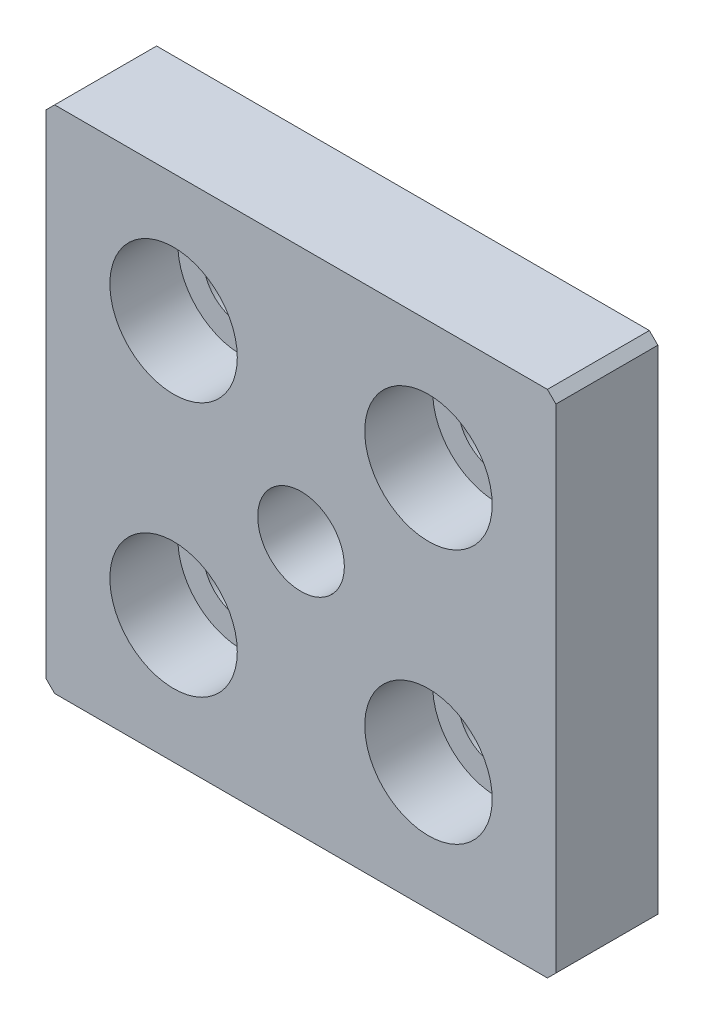
ISO-10303-21;
HEADER;
FILE_DESCRIPTION(('STEP AP214'),'2;1');
FILE_NAME('part.step','',(''),(''),'','','');
FILE_SCHEMA(('AUTOMOTIVE_DESIGN { 1 0 10303 214 1 1 1 1 }'));
ENDSEC;
DATA;
#1=APPLICATION_CONTEXT('core data for automotive mechanical design processes');
#2=APPLICATION_PROTOCOL_DEFINITION('international standard','automotive_design',2000,#1);
#3=PRODUCT_CONTEXT('',#1,'mechanical');
#4=PRODUCT('Part','Part','',(#3));
#5=PRODUCT_RELATED_PRODUCT_CATEGORY('part','',(#4));
#6=PRODUCT_DEFINITION_FORMATION('','',#4);
#7=PRODUCT_DEFINITION_CONTEXT('part definition',#1,'design');
#8=PRODUCT_DEFINITION('design','',#6,#7);
#9=PRODUCT_DEFINITION_SHAPE('','',#8);
#10=(LENGTH_UNIT() NAMED_UNIT(*) SI_UNIT(.MILLI.,.METRE.));
#11=(NAMED_UNIT(*) PLANE_ANGLE_UNIT() SI_UNIT($,.RADIAN.));
#12=(NAMED_UNIT(*) SI_UNIT($,.STERADIAN.) SOLID_ANGLE_UNIT());
#13=UNCERTAINTY_MEASURE_WITH_UNIT(LENGTH_MEASURE(1.E-05),#10,'distance_accuracy_value','');
#14=(GEOMETRIC_REPRESENTATION_CONTEXT(3) GLOBAL_UNCERTAINTY_ASSIGNED_CONTEXT((#13)) GLOBAL_UNIT_ASSIGNED_CONTEXT((#10,
#11,#12)) REPRESENTATION_CONTEXT('',''));
#15=CARTESIAN_POINT('',(0.,0.,0.));
#16=DIRECTION('',(0.,0.,1.));
#17=DIRECTION('',(1.,0.,0.));
#18=AXIS2_PLACEMENT_3D('',#15,#16,#17);
#19=CARTESIAN_POINT('',(30.,30.,12.));
#20=DIRECTION('',(-1.,0.,0.));
#21=DIRECTION('',(0.,-1.,0.));
#22=AXIS2_PLACEMENT_3D('',#19,#20,#21);
#23=PLANE('',#22);
#24=DIRECTION('',(0.,1.,0.));
#25=VECTOR('',#24,1.);
#26=CARTESIAN_POINT('',(30.,30.,12.));
#27=LINE('',#26,#25);
#28=CARTESIAN_POINT('',(30.,-29.,12.));
#29=VERTEX_POINT('',#28);
#30=CARTESIAN_POINT('',(30.,29.,12.));
#31=VERTEX_POINT('',#30);
#32=EDGE_CURVE('E141',#29,#31,#27,.T.);
#33=ORIENTED_EDGE('',*,*,#32,.F.);
#34=DIRECTION('',(0.,0.,-1.));
#35=VECTOR('',#34,1.);
#36=CARTESIAN_POINT('',(30.,-29.,12.));
#37=LINE('',#36,#35);
#38=CARTESIAN_POINT('',(30.,-29.,0.));
#39=VERTEX_POINT('',#38);
#40=EDGE_CURVE('E125',#29,#39,#37,.T.);
#41=ORIENTED_EDGE('',*,*,#40,.T.);
#42=DIRECTION('',(0.,1.,0.));
#43=VECTOR('',#42,1.);
#44=CARTESIAN_POINT('',(30.,30.,0.));
#45=LINE('',#44,#43);
#46=CARTESIAN_POINT('',(30.,29.,0.));
#47=VERTEX_POINT('',#46);
#48=EDGE_CURVE('E138',#39,#47,#45,.T.);
#49=ORIENTED_EDGE('',*,*,#48,.T.);
#50=DIRECTION('',(0.,0.,1.));
#51=VECTOR('',#50,1.);
#52=CARTESIAN_POINT('',(30.,29.,12.));
#53=LINE('',#52,#51);
#54=EDGE_CURVE('E144',#47,#31,#53,.T.);
#55=ORIENTED_EDGE('',*,*,#54,.T.);
#56=EDGE_LOOP('',(#33,#41,#49,#55));
#57=FACE_BOUND('',#56,.T.);
#58=ADVANCED_FACE('F53',(#57),#23,.F.);
#59=CARTESIAN_POINT('',(-30.,30.,12.));
#60=DIRECTION('',(0.,-1.,0.));
#61=DIRECTION('',(0.,0.,-1.));
#62=AXIS2_PLACEMENT_3D('',#59,#60,#61);
#63=PLANE('',#62);
#64=DIRECTION('',(-1.,0.,0.));
#65=VECTOR('',#64,1.);
#66=CARTESIAN_POINT('',(-30.,30.,0.));
#67=LINE('',#66,#65);
#68=CARTESIAN_POINT('',(29.,30.,0.));
#69=VERTEX_POINT('',#68);
#70=CARTESIAN_POINT('',(-29.,30.,0.));
#71=VERTEX_POINT('',#70);
#72=EDGE_CURVE('E149',#69,#71,#67,.T.);
#73=ORIENTED_EDGE('',*,*,#72,.T.);
#74=DIRECTION('',(0.,0.,1.));
#75=VECTOR('',#74,1.);
#76=CARTESIAN_POINT('',(-29.,30.,12.));
#77=LINE('',#76,#75);
#78=CARTESIAN_POINT('',(-29.,30.,12.));
#79=VERTEX_POINT('',#78);
#80=EDGE_CURVE('E11',#71,#79,#77,.T.);
#81=ORIENTED_EDGE('',*,*,#80,.T.);
#82=DIRECTION('',(-1.,0.,0.));
#83=VECTOR('',#82,1.);
#84=CARTESIAN_POINT('',(-30.,30.,12.));
#85=LINE('',#84,#83);
#86=CARTESIAN_POINT('',(29.,30.,12.));
#87=VERTEX_POINT('',#86);
#88=EDGE_CURVE('E206',#87,#79,#85,.T.);
#89=ORIENTED_EDGE('',*,*,#88,.F.);
#90=DIRECTION('',(0.,0.,-1.));
#91=VECTOR('',#90,1.);
#92=CARTESIAN_POINT('',(29.,30.,12.));
#93=LINE('',#92,#91);
#94=EDGE_CURVE('E63',#87,#69,#93,.T.);
#95=ORIENTED_EDGE('',*,*,#94,.T.);
#96=EDGE_LOOP('',(#73,#81,#89,#95));
#97=FACE_BOUND('',#96,.T.);
#98=ADVANCED_FACE('F204',(#97),#63,.F.);
#99=CARTESIAN_POINT('',(-30.,30.,12.));
#100=DIRECTION('',(1.,0.,0.));
#101=DIRECTION('',(0.,1.,0.));
#102=AXIS2_PLACEMENT_3D('',#99,#100,#101);
#103=PLANE('',#102);
#104=DIRECTION('',(0.,-1.,0.));
#105=VECTOR('',#104,1.);
#106=CARTESIAN_POINT('',(-30.,30.,0.));
#107=LINE('',#106,#105);
#108=CARTESIAN_POINT('',(-30.,29.,0.));
#109=VERTEX_POINT('',#108);
#110=CARTESIAN_POINT('',(-30.,-29.,0.));
#111=VERTEX_POINT('',#110);
#112=EDGE_CURVE('E155',#109,#111,#107,.T.);
#113=ORIENTED_EDGE('',*,*,#112,.T.);
#114=DIRECTION('',(0.,0.,1.));
#115=VECTOR('',#114,1.);
#116=CARTESIAN_POINT('',(-30.,-29.,12.));
#117=LINE('',#116,#115);
#118=CARTESIAN_POINT('',(-30.,-29.,12.));
#119=VERTEX_POINT('',#118);
#120=EDGE_CURVE('E70',#111,#119,#117,.T.);
#121=ORIENTED_EDGE('',*,*,#120,.T.);
#122=DIRECTION('',(0.,-1.,0.));
#123=VECTOR('',#122,1.);
#124=CARTESIAN_POINT('',(-30.,30.,12.));
#125=LINE('',#124,#123);
#126=CARTESIAN_POINT('',(-30.,29.,12.));
#127=VERTEX_POINT('',#126);
#128=EDGE_CURVE('E214',#127,#119,#125,.T.);
#129=ORIENTED_EDGE('',*,*,#128,.F.);
#130=DIRECTION('',(0.,0.,-1.));
#131=VECTOR('',#130,1.);
#132=CARTESIAN_POINT('',(-30.,29.,12.));
#133=LINE('',#132,#131);
#134=EDGE_CURVE('E194',#127,#109,#133,.T.);
#135=ORIENTED_EDGE('',*,*,#134,.T.);
#136=EDGE_LOOP('',(#113,#121,#129,#135));
#137=FACE_BOUND('',#136,.T.);
#138=ADVANCED_FACE('F213',(#137),#103,.F.);
#139=CARTESIAN_POINT('',(-30.,-30.,12.));
#140=DIRECTION('',(0.,1.,0.));
#141=DIRECTION('',(0.,0.,1.));
#142=AXIS2_PLACEMENT_3D('',#139,#140,#141);
#143=PLANE('',#142);
#144=DIRECTION('',(1.,0.,0.));
#145=VECTOR('',#144,1.);
#146=CARTESIAN_POINT('',(-30.,-30.,0.));
#147=LINE('',#146,#145);
#148=CARTESIAN_POINT('',(-29.,-30.,0.));
#149=VERTEX_POINT('',#148);
#150=CARTESIAN_POINT('',(29.,-30.,0.));
#151=VERTEX_POINT('',#150);
#152=EDGE_CURVE('E166',#149,#151,#147,.T.);
#153=ORIENTED_EDGE('',*,*,#152,.T.);
#154=DIRECTION('',(0.,0.,1.));
#155=VECTOR('',#154,1.);
#156=CARTESIAN_POINT('',(29.,-30.,12.));
#157=LINE('',#156,#155);
#158=CARTESIAN_POINT('',(29.,-30.,12.));
#159=VERTEX_POINT('',#158);
#160=EDGE_CURVE('E126',#151,#159,#157,.T.);
#161=ORIENTED_EDGE('',*,*,#160,.T.);
#162=DIRECTION('',(1.,0.,0.));
#163=VECTOR('',#162,1.);
#164=CARTESIAN_POINT('',(-30.,-30.,12.));
#165=LINE('',#164,#163);
#166=CARTESIAN_POINT('',(-29.,-30.,12.));
#167=VERTEX_POINT('',#166);
#168=EDGE_CURVE('E161',#167,#159,#165,.T.);
#169=ORIENTED_EDGE('',*,*,#168,.F.);
#170=DIRECTION('',(0.,0.,-1.));
#171=VECTOR('',#170,1.);
#172=CARTESIAN_POINT('',(-29.,-30.,12.));
#173=LINE('',#172,#171);
#174=EDGE_CURVE('E132',#167,#149,#173,.T.);
#175=ORIENTED_EDGE('',*,*,#174,.T.);
#176=EDGE_LOOP('',(#153,#161,#169,#175));
#177=FACE_BOUND('',#176,.T.);
#178=ADVANCED_FACE('F297',(#177),#143,.F.);
#179=CARTESIAN_POINT('',(0.,0.,12.));
#180=DIRECTION('',(0.,0.,1.));
#181=DIRECTION('',(1.,0.,0.));
#182=AXIS2_PLACEMENT_3D('',#179,#180,#181);
#183=PLANE('',#182);
#184=CARTESIAN_POINT('',(-15.,15.,12.));
#185=DIRECTION('',(0.,0.,1.));
#186=DIRECTION('',(1.,0.,0.));
#187=AXIS2_PLACEMENT_3D('',#184,#185,#186);
#188=CIRCLE('',#187,7.5);
#189=CARTESIAN_POINT('',(-7.5,15.,12.));
#190=VERTEX_POINT('',#189);
#191=EDGE_CURVE('E287',#190,#190,#188,.T.);
#192=ORIENTED_EDGE('',*,*,#191,.F.);
#193=EDGE_LOOP('',(#192));
#194=FACE_BOUND('',#193,.T.);
#195=CARTESIAN_POINT('',(15.,15.,12.));
#196=DIRECTION('',(0.,0.,1.));
#197=DIRECTION('',(1.,0.,0.));
#198=AXIS2_PLACEMENT_3D('',#195,#196,#197);
#199=CIRCLE('',#198,7.5);
#200=CARTESIAN_POINT('',(22.5,15.,12.));
#201=VERTEX_POINT('',#200);
#202=EDGE_CURVE('E271',#201,#201,#199,.T.);
#203=ORIENTED_EDGE('',*,*,#202,.F.);
#204=EDGE_LOOP('',(#203));
#205=FACE_BOUND('',#204,.T.);
#206=CARTESIAN_POINT('',(15.,-15.,12.));
#207=DIRECTION('',(0.,0.,1.));
#208=DIRECTION('',(1.,0.,0.));
#209=AXIS2_PLACEMENT_3D('',#206,#207,#208);
#210=CIRCLE('',#209,7.5);
#211=CARTESIAN_POINT('',(22.5,-15.,12.));
#212=VERTEX_POINT('',#211);
#213=EDGE_CURVE('E255',#212,#212,#210,.T.);
#214=ORIENTED_EDGE('',*,*,#213,.F.);
#215=EDGE_LOOP('',(#214));
#216=FACE_BOUND('',#215,.T.);
#217=CARTESIAN_POINT('',(-15.,-15.,12.));
#218=DIRECTION('',(0.,0.,1.));
#219=DIRECTION('',(1.,0.,0.));
#220=AXIS2_PLACEMENT_3D('',#217,#218,#219);
#221=CIRCLE('',#220,7.5);
#222=CARTESIAN_POINT('',(-7.5,-15.,12.));
#223=VERTEX_POINT('',#222);
#224=EDGE_CURVE('E239',#223,#223,#221,.T.);
#225=ORIENTED_EDGE('',*,*,#224,.F.);
#226=EDGE_LOOP('',(#225));
#227=FACE_BOUND('',#226,.T.);
#228=CARTESIAN_POINT('',(0.,0.,12.));
#229=DIRECTION('',(0.,0.,1.));
#230=DIRECTION('',(1.,0.,0.));
#231=AXIS2_PLACEMENT_3D('',#228,#229,#230);
#232=CIRCLE('',#231,5.1);
#233=CARTESIAN_POINT('',(5.1,0.,12.));
#234=VERTEX_POINT('',#233);
#235=EDGE_CURVE('E158',#234,#234,#232,.T.);
#236=ORIENTED_EDGE('',*,*,#235,.F.);
#237=EDGE_LOOP('',(#236));
#238=FACE_BOUND('',#237,.T.);
#239=ORIENTED_EDGE('',*,*,#168,.T.);
#240=DIRECTION('',(-0.707106781186548,-0.707106781186548,0.));
#241=VECTOR('',#240,1.);
#242=CARTESIAN_POINT('',(29.5,-29.5,12.));
#243=LINE('',#242,#241);
#244=EDGE_CURVE('E191',#159,#29,#243,.F.);
#245=ORIENTED_EDGE('',*,*,#244,.T.);
#246=ORIENTED_EDGE('',*,*,#32,.T.);
#247=DIRECTION('',(0.707106781186548,-0.707106781186548,0.));
#248=VECTOR('',#247,1.);
#249=CARTESIAN_POINT('',(29.5,29.5,12.));
#250=LINE('',#249,#248);
#251=EDGE_CURVE('E183',#31,#87,#250,.F.);
#252=ORIENTED_EDGE('',*,*,#251,.T.);
#253=ORIENTED_EDGE('',*,*,#88,.T.);
#254=DIRECTION('',(0.707106781186548,0.707106781186548,0.));
#255=VECTOR('',#254,1.);
#256=CARTESIAN_POINT('',(-29.5,29.5,12.));
#257=LINE('',#256,#255);
#258=EDGE_CURVE('E77',#79,#127,#257,.F.);
#259=ORIENTED_EDGE('',*,*,#258,.T.);
#260=ORIENTED_EDGE('',*,*,#128,.T.);
#261=DIRECTION('',(-0.707106781186548,0.707106781186548,0.));
#262=VECTOR('',#261,1.);
#263=CARTESIAN_POINT('',(-29.5,-29.5,12.));
#264=LINE('',#263,#262);
#265=EDGE_CURVE('E188',#119,#167,#264,.F.);
#266=ORIENTED_EDGE('',*,*,#265,.T.);
#267=EDGE_LOOP('',(#239,#245,#246,#252,#253,#259,#260,#266));
#268=FACE_BOUND('',#267,.T.);
#269=ADVANCED_FACE('F294',(#194,#205,#216,#227,#238,#268),#183,.T.);
#270=CARTESIAN_POINT('',(0.,0.,0.));
#271=DIRECTION('',(0.,0.,1.));
#272=DIRECTION('',(1.,0.,0.));
#273=AXIS2_PLACEMENT_3D('',#270,#271,#272);
#274=PLANE('',#273);
#275=CARTESIAN_POINT('',(-15.,15.,0.));
#276=DIRECTION('',(0.,0.,1.));
#277=DIRECTION('',(1.,0.,0.));
#278=AXIS2_PLACEMENT_3D('',#275,#276,#277);
#279=CIRCLE('',#278,4.5);
#280=CARTESIAN_POINT('',(-10.5,15.,0.));
#281=VERTEX_POINT('',#280);
#282=EDGE_CURVE('E275',#281,#281,#279,.T.);
#283=ORIENTED_EDGE('',*,*,#282,.T.);
#284=EDGE_LOOP('',(#283));
#285=FACE_BOUND('',#284,.T.);
#286=CARTESIAN_POINT('',(15.,15.,0.));
#287=DIRECTION('',(0.,0.,1.));
#288=DIRECTION('',(1.,0.,0.));
#289=AXIS2_PLACEMENT_3D('',#286,#287,#288);
#290=CIRCLE('',#289,4.5);
#291=CARTESIAN_POINT('',(19.5,15.,0.));
#292=VERTEX_POINT('',#291);
#293=EDGE_CURVE('E259',#292,#292,#290,.T.);
#294=ORIENTED_EDGE('',*,*,#293,.T.);
#295=EDGE_LOOP('',(#294));
#296=FACE_BOUND('',#295,.T.);
#297=CARTESIAN_POINT('',(15.,-15.,0.));
#298=DIRECTION('',(0.,0.,1.));
#299=DIRECTION('',(1.,0.,0.));
#300=AXIS2_PLACEMENT_3D('',#297,#298,#299);
#301=CIRCLE('',#300,4.5);
#302=CARTESIAN_POINT('',(19.5,-15.,0.));
#303=VERTEX_POINT('',#302);
#304=EDGE_CURVE('E243',#303,#303,#301,.T.);
#305=ORIENTED_EDGE('',*,*,#304,.T.);
#306=EDGE_LOOP('',(#305));
#307=FACE_BOUND('',#306,.T.);
#308=CARTESIAN_POINT('',(-15.,-15.,0.));
#309=DIRECTION('',(0.,0.,1.));
#310=DIRECTION('',(1.,0.,0.));
#311=AXIS2_PLACEMENT_3D('',#308,#309,#310);
#312=CIRCLE('',#311,4.5);
#313=CARTESIAN_POINT('',(-10.5,-15.,0.));
#314=VERTEX_POINT('',#313);
#315=EDGE_CURVE('E227',#314,#314,#312,.T.);
#316=ORIENTED_EDGE('',*,*,#315,.T.);
#317=EDGE_LOOP('',(#316));
#318=FACE_BOUND('',#317,.T.);
#319=CARTESIAN_POINT('',(0.,0.,0.));
#320=DIRECTION('',(0.,0.,1.));
#321=DIRECTION('',(1.,0.,0.));
#322=AXIS2_PLACEMENT_3D('',#319,#320,#321);
#323=CIRCLE('',#322,5.1);
#324=CARTESIAN_POINT('',(5.1,0.,0.));
#325=VERTEX_POINT('',#324);
#326=EDGE_CURVE('E150',#325,#325,#323,.T.);
#327=ORIENTED_EDGE('',*,*,#326,.T.);
#328=EDGE_LOOP('',(#327));
#329=FACE_BOUND('',#328,.T.);
#330=ORIENTED_EDGE('',*,*,#48,.F.);
#331=DIRECTION('',(0.707106781186548,0.707106781186548,0.));
#332=VECTOR('',#331,1.);
#333=CARTESIAN_POINT('',(30.,-29.,0.));
#334=LINE('',#333,#332);
#335=EDGE_CURVE('E121',#39,#151,#334,.F.);
#336=ORIENTED_EDGE('',*,*,#335,.T.);
#337=ORIENTED_EDGE('',*,*,#152,.F.);
#338=DIRECTION('',(0.707106781186548,-0.707106781186548,0.));
#339=VECTOR('',#338,1.);
#340=CARTESIAN_POINT('',(-29.,-30.,0.));
#341=LINE('',#340,#339);
#342=EDGE_CURVE('E133',#149,#111,#341,.F.);
#343=ORIENTED_EDGE('',*,*,#342,.T.);
#344=ORIENTED_EDGE('',*,*,#112,.F.);
#345=DIRECTION('',(-0.707106781186548,-0.707106781186548,0.));
#346=VECTOR('',#345,1.);
#347=CARTESIAN_POINT('',(-30.,29.,0.));
#348=LINE('',#347,#346);
#349=EDGE_CURVE('E173',#109,#71,#348,.F.);
#350=ORIENTED_EDGE('',*,*,#349,.T.);
#351=ORIENTED_EDGE('',*,*,#72,.F.);
#352=DIRECTION('',(-0.707106781186548,0.707106781186548,0.));
#353=VECTOR('',#352,1.);
#354=CARTESIAN_POINT('',(29.,30.,0.));
#355=LINE('',#354,#353);
#356=EDGE_CURVE('E143',#69,#47,#355,.F.);
#357=ORIENTED_EDGE('',*,*,#356,.T.);
#358=EDGE_LOOP('',(#330,#336,#337,#343,#344,#350,#351,#357));
#359=FACE_BOUND('',#358,.T.);
#360=ADVANCED_FACE('F146',(#285,#296,#307,#318,#329,#359),#274,.F.);
#361=CARTESIAN_POINT('',(0.,0.,12.));
#362=DIRECTION('',(0.,0.,1.));
#363=DIRECTION('',(1.,0.,0.));
#364=AXIS2_PLACEMENT_3D('',#361,#362,#363);
#365=CYLINDRICAL_SURFACE('',#364,5.1);
#366=ORIENTED_EDGE('',*,*,#326,.F.);
#367=EDGE_LOOP('',(#366));
#368=FACE_BOUND('',#367,.T.);
#369=ORIENTED_EDGE('',*,*,#235,.T.);
#370=EDGE_LOOP('',(#369));
#371=FACE_BOUND('',#370,.T.);
#372=ADVANCED_FACE('F342',(#368,#371),#365,.F.);
#373=CARTESIAN_POINT('',(-15.,-15.,12.));
#374=DIRECTION('',(0.,0.,1.));
#375=DIRECTION('',(1.,0.,0.));
#376=AXIS2_PLACEMENT_3D('',#373,#374,#375);
#377=CYLINDRICAL_SURFACE('',#376,4.5);
#378=ORIENTED_EDGE('',*,*,#315,.F.);
#379=EDGE_LOOP('',(#378));
#380=FACE_BOUND('',#379,.T.);
#381=CARTESIAN_POINT('',(-15.,-15.,4.));
#382=DIRECTION('',(0.,0.,1.));
#383=DIRECTION('',(1.,0.,0.));
#384=AXIS2_PLACEMENT_3D('',#381,#382,#383);
#385=CIRCLE('',#384,4.5);
#386=CARTESIAN_POINT('',(-10.5,-15.,4.));
#387=VERTEX_POINT('',#386);
#388=EDGE_CURVE('E231',#387,#387,#385,.T.);
#389=ORIENTED_EDGE('',*,*,#388,.T.);
#390=EDGE_LOOP('',(#389));
#391=FACE_BOUND('',#390,.T.);
#392=ADVANCED_FACE('F347',(#380,#391),#377,.F.);
#393=CARTESIAN_POINT('',(-10.5,-15.,4.));
#394=DIRECTION('',(0.,0.,-1.));
#395=DIRECTION('',(-1.,0.,0.));
#396=AXIS2_PLACEMENT_3D('',#393,#394,#395);
#397=PLANE('',#396);
#398=ORIENTED_EDGE('',*,*,#388,.F.);
#399=EDGE_LOOP('',(#398));
#400=FACE_BOUND('',#399,.T.);
#401=CARTESIAN_POINT('',(-15.,-15.,4.));
#402=DIRECTION('',(0.,0.,1.));
#403=DIRECTION('',(1.,0.,0.));
#404=AXIS2_PLACEMENT_3D('',#401,#402,#403);
#405=CIRCLE('',#404,7.5);
#406=CARTESIAN_POINT('',(-7.5,-15.,4.));
#407=VERTEX_POINT('',#406);
#408=EDGE_CURVE('E235',#407,#407,#405,.T.);
#409=ORIENTED_EDGE('',*,*,#408,.T.);
#410=EDGE_LOOP('',(#409));
#411=FACE_BOUND('',#410,.T.);
#412=ADVANCED_FACE('F351',(#400,#411),#397,.F.);
#413=CARTESIAN_POINT('',(-15.,-15.,12.));
#414=DIRECTION('',(0.,0.,1.));
#415=DIRECTION('',(1.,0.,0.));
#416=AXIS2_PLACEMENT_3D('',#413,#414,#415);
#417=CYLINDRICAL_SURFACE('',#416,7.5);
#418=ORIENTED_EDGE('',*,*,#408,.F.);
#419=EDGE_LOOP('',(#418));
#420=FACE_BOUND('',#419,.T.);
#421=ORIENTED_EDGE('',*,*,#224,.T.);
#422=EDGE_LOOP('',(#421));
#423=FACE_BOUND('',#422,.T.);
#424=ADVANCED_FACE('F355',(#420,#423),#417,.F.);
#425=CARTESIAN_POINT('',(15.,-15.,12.));
#426=DIRECTION('',(0.,0.,1.));
#427=DIRECTION('',(1.,0.,0.));
#428=AXIS2_PLACEMENT_3D('',#425,#426,#427);
#429=CYLINDRICAL_SURFACE('',#428,4.5);
#430=ORIENTED_EDGE('',*,*,#304,.F.);
#431=EDGE_LOOP('',(#430));
#432=FACE_BOUND('',#431,.T.);
#433=CARTESIAN_POINT('',(15.,-15.,4.));
#434=DIRECTION('',(0.,0.,1.));
#435=DIRECTION('',(1.,0.,0.));
#436=AXIS2_PLACEMENT_3D('',#433,#434,#435);
#437=CIRCLE('',#436,4.5);
#438=CARTESIAN_POINT('',(19.5,-15.,4.));
#439=VERTEX_POINT('',#438);
#440=EDGE_CURVE('E247',#439,#439,#437,.T.);
#441=ORIENTED_EDGE('',*,*,#440,.T.);
#442=EDGE_LOOP('',(#441));
#443=FACE_BOUND('',#442,.T.);
#444=ADVANCED_FACE('F359',(#432,#443),#429,.F.);
#445=CARTESIAN_POINT('',(19.5,-15.,4.));
#446=DIRECTION('',(0.,0.,-1.));
#447=DIRECTION('',(-1.,0.,0.));
#448=AXIS2_PLACEMENT_3D('',#445,#446,#447);
#449=PLANE('',#448);
#450=ORIENTED_EDGE('',*,*,#440,.F.);
#451=EDGE_LOOP('',(#450));
#452=FACE_BOUND('',#451,.T.);
#453=CARTESIAN_POINT('',(15.,-15.,4.));
#454=DIRECTION('',(0.,0.,1.));
#455=DIRECTION('',(1.,0.,0.));
#456=AXIS2_PLACEMENT_3D('',#453,#454,#455);
#457=CIRCLE('',#456,7.5);
#458=CARTESIAN_POINT('',(22.5,-15.,4.));
#459=VERTEX_POINT('',#458);
#460=EDGE_CURVE('E251',#459,#459,#457,.T.);
#461=ORIENTED_EDGE('',*,*,#460,.T.);
#462=EDGE_LOOP('',(#461));
#463=FACE_BOUND('',#462,.T.);
#464=ADVANCED_FACE('F363',(#452,#463),#449,.F.);
#465=CARTESIAN_POINT('',(15.,-15.,12.));
#466=DIRECTION('',(0.,0.,1.));
#467=DIRECTION('',(1.,0.,0.));
#468=AXIS2_PLACEMENT_3D('',#465,#466,#467);
#469=CYLINDRICAL_SURFACE('',#468,7.5);
#470=ORIENTED_EDGE('',*,*,#460,.F.);
#471=EDGE_LOOP('',(#470));
#472=FACE_BOUND('',#471,.T.);
#473=ORIENTED_EDGE('',*,*,#213,.T.);
#474=EDGE_LOOP('',(#473));
#475=FACE_BOUND('',#474,.T.);
#476=ADVANCED_FACE('F367',(#472,#475),#469,.F.);
#477=CARTESIAN_POINT('',(15.,15.,12.));
#478=DIRECTION('',(0.,0.,1.));
#479=DIRECTION('',(1.,0.,0.));
#480=AXIS2_PLACEMENT_3D('',#477,#478,#479);
#481=CYLINDRICAL_SURFACE('',#480,4.5);
#482=ORIENTED_EDGE('',*,*,#293,.F.);
#483=EDGE_LOOP('',(#482));
#484=FACE_BOUND('',#483,.T.);
#485=CARTESIAN_POINT('',(15.,15.,4.));
#486=DIRECTION('',(0.,0.,1.));
#487=DIRECTION('',(1.,0.,0.));
#488=AXIS2_PLACEMENT_3D('',#485,#486,#487);
#489=CIRCLE('',#488,4.5);
#490=CARTESIAN_POINT('',(19.5,15.,4.));
#491=VERTEX_POINT('',#490);
#492=EDGE_CURVE('E263',#491,#491,#489,.T.);
#493=ORIENTED_EDGE('',*,*,#492,.T.);
#494=EDGE_LOOP('',(#493));
#495=FACE_BOUND('',#494,.T.);
#496=ADVANCED_FACE('F371',(#484,#495),#481,.F.);
#497=CARTESIAN_POINT('',(19.5,15.,4.));
#498=DIRECTION('',(0.,0.,-1.));
#499=DIRECTION('',(-1.,0.,0.));
#500=AXIS2_PLACEMENT_3D('',#497,#498,#499);
#501=PLANE('',#500);
#502=ORIENTED_EDGE('',*,*,#492,.F.);
#503=EDGE_LOOP('',(#502));
#504=FACE_BOUND('',#503,.T.);
#505=CARTESIAN_POINT('',(15.,15.,4.));
#506=DIRECTION('',(0.,0.,1.));
#507=DIRECTION('',(1.,0.,0.));
#508=AXIS2_PLACEMENT_3D('',#505,#506,#507);
#509=CIRCLE('',#508,7.5);
#510=CARTESIAN_POINT('',(22.5,15.,4.));
#511=VERTEX_POINT('',#510);
#512=EDGE_CURVE('E267',#511,#511,#509,.T.);
#513=ORIENTED_EDGE('',*,*,#512,.T.);
#514=EDGE_LOOP('',(#513));
#515=FACE_BOUND('',#514,.T.);
#516=ADVANCED_FACE('F375',(#504,#515),#501,.F.);
#517=CARTESIAN_POINT('',(15.,15.,12.));
#518=DIRECTION('',(0.,0.,1.));
#519=DIRECTION('',(1.,0.,0.));
#520=AXIS2_PLACEMENT_3D('',#517,#518,#519);
#521=CYLINDRICAL_SURFACE('',#520,7.5);
#522=ORIENTED_EDGE('',*,*,#512,.F.);
#523=EDGE_LOOP('',(#522));
#524=FACE_BOUND('',#523,.T.);
#525=ORIENTED_EDGE('',*,*,#202,.T.);
#526=EDGE_LOOP('',(#525));
#527=FACE_BOUND('',#526,.T.);
#528=ADVANCED_FACE('F379',(#524,#527),#521,.F.);
#529=CARTESIAN_POINT('',(-15.,15.,12.));
#530=DIRECTION('',(0.,0.,1.));
#531=DIRECTION('',(1.,0.,0.));
#532=AXIS2_PLACEMENT_3D('',#529,#530,#531);
#533=CYLINDRICAL_SURFACE('',#532,4.5);
#534=ORIENTED_EDGE('',*,*,#282,.F.);
#535=EDGE_LOOP('',(#534));
#536=FACE_BOUND('',#535,.T.);
#537=CARTESIAN_POINT('',(-15.,15.,4.));
#538=DIRECTION('',(0.,0.,1.));
#539=DIRECTION('',(1.,0.,0.));
#540=AXIS2_PLACEMENT_3D('',#537,#538,#539);
#541=CIRCLE('',#540,4.5);
#542=CARTESIAN_POINT('',(-10.5,15.,4.));
#543=VERTEX_POINT('',#542);
#544=EDGE_CURVE('E279',#543,#543,#541,.T.);
#545=ORIENTED_EDGE('',*,*,#544,.T.);
#546=EDGE_LOOP('',(#545));
#547=FACE_BOUND('',#546,.T.);
#548=ADVANCED_FACE('F383',(#536,#547),#533,.F.);
#549=CARTESIAN_POINT('',(-10.5,15.,4.));
#550=DIRECTION('',(0.,0.,-1.));
#551=DIRECTION('',(-1.,0.,0.));
#552=AXIS2_PLACEMENT_3D('',#549,#550,#551);
#553=PLANE('',#552);
#554=ORIENTED_EDGE('',*,*,#544,.F.);
#555=EDGE_LOOP('',(#554));
#556=FACE_BOUND('',#555,.T.);
#557=CARTESIAN_POINT('',(-15.,15.,4.));
#558=DIRECTION('',(0.,0.,1.));
#559=DIRECTION('',(1.,0.,0.));
#560=AXIS2_PLACEMENT_3D('',#557,#558,#559);
#561=CIRCLE('',#560,7.5);
#562=CARTESIAN_POINT('',(-7.5,15.,4.));
#563=VERTEX_POINT('',#562);
#564=EDGE_CURVE('E283',#563,#563,#561,.T.);
#565=ORIENTED_EDGE('',*,*,#564,.T.);
#566=EDGE_LOOP('',(#565));
#567=FACE_BOUND('',#566,.T.);
#568=ADVANCED_FACE('F387',(#556,#567),#553,.F.);
#569=CARTESIAN_POINT('',(-15.,15.,12.));
#570=DIRECTION('',(0.,0.,1.));
#571=DIRECTION('',(1.,0.,0.));
#572=AXIS2_PLACEMENT_3D('',#569,#570,#571);
#573=CYLINDRICAL_SURFACE('',#572,7.5);
#574=ORIENTED_EDGE('',*,*,#564,.F.);
#575=EDGE_LOOP('',(#574));
#576=FACE_BOUND('',#575,.T.);
#577=ORIENTED_EDGE('',*,*,#191,.T.);
#578=EDGE_LOOP('',(#577));
#579=FACE_BOUND('',#578,.T.);
#580=ADVANCED_FACE('F292',(#576,#579),#573,.F.);
#581=CARTESIAN_POINT('',(30.,-29.,12.));
#582=DIRECTION('',(-0.707106781186547,0.707106781186547,0.));
#583=DIRECTION('',(0.,0.,-1.));
#584=AXIS2_PLACEMENT_3D('',#581,#582,#583);
#585=PLANE('',#584);
#586=ORIENTED_EDGE('',*,*,#244,.F.);
#587=ORIENTED_EDGE('',*,*,#160,.F.);
#588=ORIENTED_EDGE('',*,*,#335,.F.);
#589=ORIENTED_EDGE('',*,*,#40,.F.);
#590=EDGE_LOOP('',(#586,#587,#588,#589));
#591=FACE_BOUND('',#590,.T.);
#592=ADVANCED_FACE('F124',(#591),#585,.F.);
#593=CARTESIAN_POINT('',(-29.,-30.,12.));
#594=DIRECTION('',(0.707106781186547,0.707106781186547,0.));
#595=DIRECTION('',(0.,0.,-1.));
#596=AXIS2_PLACEMENT_3D('',#593,#594,#595);
#597=PLANE('',#596);
#598=ORIENTED_EDGE('',*,*,#265,.F.);
#599=ORIENTED_EDGE('',*,*,#120,.F.);
#600=ORIENTED_EDGE('',*,*,#342,.F.);
#601=ORIENTED_EDGE('',*,*,#174,.F.);
#602=EDGE_LOOP('',(#598,#599,#600,#601));
#603=FACE_BOUND('',#602,.T.);
#604=ADVANCED_FACE('F310',(#603),#597,.F.);
#605=CARTESIAN_POINT('',(-30.,29.,12.));
#606=DIRECTION('',(0.707106781186547,-0.707106781186547,0.));
#607=DIRECTION('',(0.,0.,-1.));
#608=AXIS2_PLACEMENT_3D('',#605,#606,#607);
#609=PLANE('',#608);
#610=ORIENTED_EDGE('',*,*,#258,.F.);
#611=ORIENTED_EDGE('',*,*,#80,.F.);
#612=ORIENTED_EDGE('',*,*,#349,.F.);
#613=ORIENTED_EDGE('',*,*,#134,.F.);
#614=EDGE_LOOP('',(#610,#611,#612,#613));
#615=FACE_BOUND('',#614,.T.);
#616=ADVANCED_FACE('F212',(#615),#609,.F.);
#617=CARTESIAN_POINT('',(29.,30.,12.));
#618=DIRECTION('',(-0.707106781186547,-0.707106781186547,0.));
#619=DIRECTION('',(0.,0.,-1.));
#620=AXIS2_PLACEMENT_3D('',#617,#618,#619);
#621=PLANE('',#620);
#622=ORIENTED_EDGE('',*,*,#251,.F.);
#623=ORIENTED_EDGE('',*,*,#54,.F.);
#624=ORIENTED_EDGE('',*,*,#356,.F.);
#625=ORIENTED_EDGE('',*,*,#94,.F.);
#626=EDGE_LOOP('',(#622,#623,#624,#625));
#627=FACE_BOUND('',#626,.T.);
#628=ADVANCED_FACE('F56',(#627),#621,.F.);
#629=CLOSED_SHELL('',(#58,#98,#138,#178,#269,#360,#372,#392,#412,#424,#444,#464,#476,#496,#516,
#528,#548,#568,#580,#592,#604,#616,#628));
#630=MANIFOLD_SOLID_BREP('B2',#629);
#631=ADVANCED_BREP_SHAPE_REPRESENTATION('',(#18,#630),#14);
#632=SHAPE_DEFINITION_REPRESENTATION(#9,#631);
ENDSEC;
END-ISO-10303-21;
